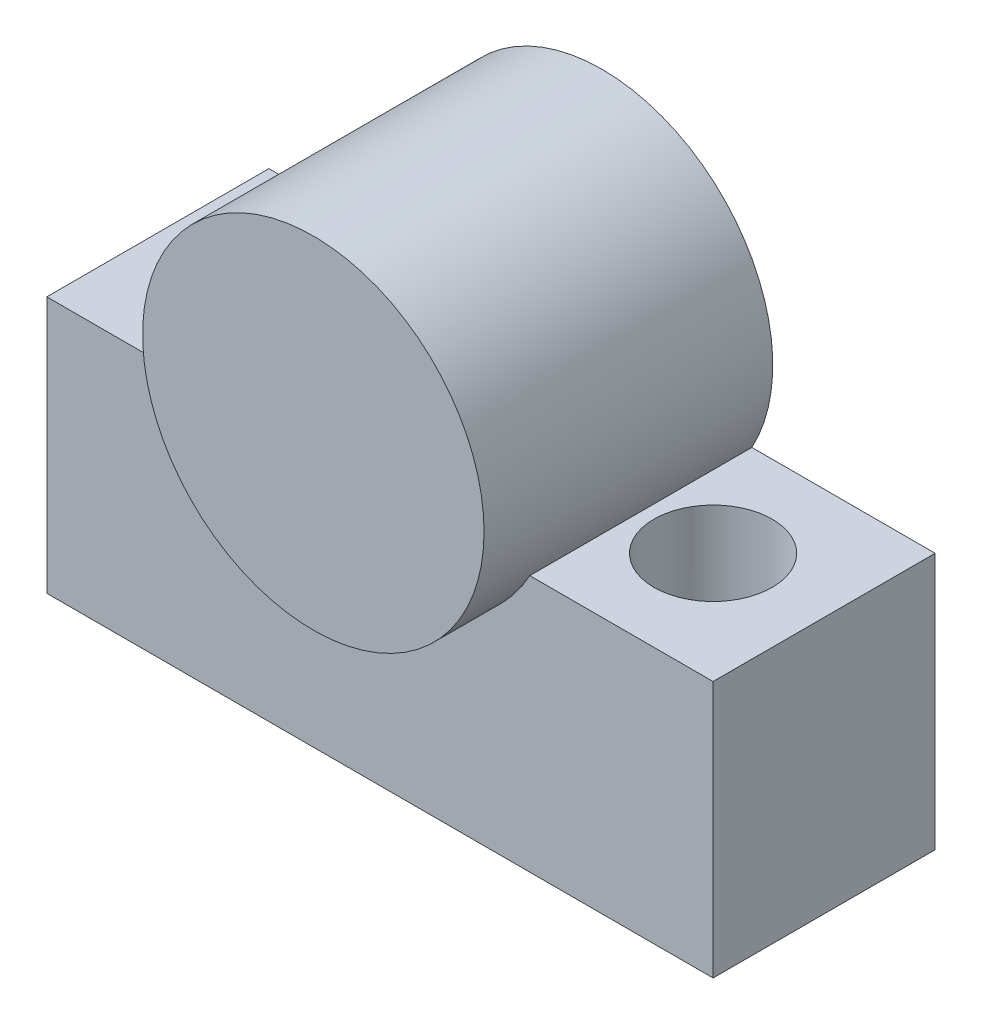
ISO-10303-21;
HEADER;
FILE_DESCRIPTION(('STEP AP214'),'2;1');
FILE_NAME('part.step','',(''),(''),'','','');
FILE_SCHEMA(('AUTOMOTIVE_DESIGN { 1 0 10303 214 1 1 1 1 }'));
ENDSEC;
DATA;
#1=APPLICATION_CONTEXT('core data for automotive mechanical design processes');
#2=APPLICATION_PROTOCOL_DEFINITION('international standard','automotive_design',2000,#1);
#3=PRODUCT_CONTEXT('',#1,'mechanical');
#4=PRODUCT('Part','Part','',(#3));
#5=PRODUCT_RELATED_PRODUCT_CATEGORY('part','',(#4));
#6=PRODUCT_DEFINITION_FORMATION('','',#4);
#7=PRODUCT_DEFINITION_CONTEXT('part definition',#1,'design');
#8=PRODUCT_DEFINITION('design','',#6,#7);
#9=PRODUCT_DEFINITION_SHAPE('','',#8);
#10=(LENGTH_UNIT() NAMED_UNIT(*) SI_UNIT(.MILLI.,.METRE.));
#11=(NAMED_UNIT(*) PLANE_ANGLE_UNIT() SI_UNIT($,.RADIAN.));
#12=(NAMED_UNIT(*) SI_UNIT($,.STERADIAN.) SOLID_ANGLE_UNIT());
#13=UNCERTAINTY_MEASURE_WITH_UNIT(LENGTH_MEASURE(1.E-05),#10,'distance_accuracy_value','');
#14=(GEOMETRIC_REPRESENTATION_CONTEXT(3) GLOBAL_UNCERTAINTY_ASSIGNED_CONTEXT((#13)) GLOBAL_UNIT_ASSIGNED_CONTEXT((#10,
#11,#12)) REPRESENTATION_CONTEXT('',''));
#15=CARTESIAN_POINT('',(0.,0.,0.));
#16=DIRECTION('',(0.,0.,1.));
#17=DIRECTION('',(1.,0.,0.));
#18=AXIS2_PLACEMENT_3D('',#15,#16,#17);
#19=CARTESIAN_POINT('',(0.,0.,5.08));
#20=DIRECTION('',(0.,0.,1.));
#21=DIRECTION('',(1.,0.,0.));
#22=AXIS2_PLACEMENT_3D('',#19,#20,#21);
#23=PLANE('',#22);
#24=CARTESIAN_POINT('',(0.,0.,5.08));
#25=DIRECTION('',(0.,0.,1.));
#26=DIRECTION('',(1.,0.,0.));
#27=AXIS2_PLACEMENT_3D('',#24,#25,#26);
#28=CIRCLE('',#27,3.90525);
#29=CARTESIAN_POINT('',(-3.42664734106094,-1.87325,5.08));
#30=VERTEX_POINT('',#29);
#31=CARTESIAN_POINT('',(3.42664734106094,-1.87325,5.08));
#32=VERTEX_POINT('',#31);
#33=EDGE_CURVE('E11',#30,#32,#28,.T.);
#34=ORIENTED_EDGE('',*,*,#33,.F.);
#35=DIRECTION('',(-1.,0.,0.));
#36=VECTOR('',#35,1.);
#37=CARTESIAN_POINT('',(-7.62,-1.87325,5.08));
#38=LINE('',#37,#36);
#39=CARTESIAN_POINT('',(-7.62,-1.87325,5.08));
#40=VERTEX_POINT('',#39);
#41=EDGE_CURVE('E53',#30,#40,#38,.T.);
#42=ORIENTED_EDGE('',*,*,#41,.T.);
#43=DIRECTION('',(0.,-1.,0.));
#44=VECTOR('',#43,1.);
#45=CARTESIAN_POINT('',(-7.62,-3.90525,5.08));
#46=LINE('',#45,#44);
#47=CARTESIAN_POINT('',(-7.62,-7.747,5.08));
#48=VERTEX_POINT('',#47);
#49=EDGE_CURVE('E150',#40,#48,#46,.T.);
#50=ORIENTED_EDGE('',*,*,#49,.T.);
#51=DIRECTION('',(-1.,0.,0.));
#52=VECTOR('',#51,1.);
#53=CARTESIAN_POINT('',(-7.62,-7.747,5.08));
#54=LINE('',#53,#52);
#55=CARTESIAN_POINT('',(7.62,-7.747,5.08));
#56=VERTEX_POINT('',#55);
#57=EDGE_CURVE('E121',#56,#48,#54,.T.);
#58=ORIENTED_EDGE('',*,*,#57,.F.);
#59=DIRECTION('',(0.,1.,0.));
#60=VECTOR('',#59,1.);
#61=CARTESIAN_POINT('',(7.62,-3.90525,5.08));
#62=LINE('',#61,#60);
#63=CARTESIAN_POINT('',(7.62,-1.87325,5.08));
#64=VERTEX_POINT('',#63);
#65=EDGE_CURVE('E82',#56,#64,#62,.T.);
#66=ORIENTED_EDGE('',*,*,#65,.T.);
#67=DIRECTION('',(-1.,0.,0.));
#68=VECTOR('',#67,1.);
#69=CARTESIAN_POINT('',(7.62,-1.87325,5.08));
#70=LINE('',#69,#68);
#71=EDGE_CURVE('E147',#64,#32,#70,.T.);
#72=ORIENTED_EDGE('',*,*,#71,.T.);
#73=EDGE_LOOP('',(#34,#42,#50,#58,#66,#72));
#74=FACE_BOUND('',#73,.T.);
#75=ADVANCED_FACE('F35',(#74),#23,.T.);
#76=CARTESIAN_POINT('',(0.,0.,0.));
#77=DIRECTION('',(0.,0.,1.));
#78=DIRECTION('',(1.,0.,0.));
#79=AXIS2_PLACEMENT_3D('',#76,#77,#78);
#80=PLANE('',#79);
#81=DIRECTION('',(0.,1.,0.));
#82=VECTOR('',#81,1.);
#83=CARTESIAN_POINT('',(7.62,-3.90525,0.));
#84=LINE('',#83,#82);
#85=CARTESIAN_POINT('',(7.62,-7.747,0.));
#86=VERTEX_POINT('',#85);
#87=CARTESIAN_POINT('',(7.62,-1.87325,0.));
#88=VERTEX_POINT('',#87);
#89=EDGE_CURVE('E112',#86,#88,#84,.T.);
#90=ORIENTED_EDGE('',*,*,#89,.F.);
#91=DIRECTION('',(1.,0.,0.));
#92=VECTOR('',#91,1.);
#93=CARTESIAN_POINT('',(-7.62,-7.747,0.));
#94=LINE('',#93,#92);
#95=CARTESIAN_POINT('',(-7.62,-7.747,0.));
#96=VERTEX_POINT('',#95);
#97=EDGE_CURVE('E108',#96,#86,#94,.T.);
#98=ORIENTED_EDGE('',*,*,#97,.F.);
#99=DIRECTION('',(0.,-1.,0.));
#100=VECTOR('',#99,1.);
#101=CARTESIAN_POINT('',(-7.62,-3.90525,0.));
#102=LINE('',#101,#100);
#103=CARTESIAN_POINT('',(-7.62,-1.87325,0.));
#104=VERTEX_POINT('',#103);
#105=EDGE_CURVE('E98',#104,#96,#102,.T.);
#106=ORIENTED_EDGE('',*,*,#105,.F.);
#107=DIRECTION('',(-1.,0.,0.));
#108=VECTOR('',#107,1.);
#109=CARTESIAN_POINT('',(-7.62,-1.87325,0.));
#110=LINE('',#109,#108);
#111=CARTESIAN_POINT('',(-3.42664734106094,-1.87325,0.));
#112=VERTEX_POINT('',#111);
#113=EDGE_CURVE('E77',#112,#104,#110,.T.);
#114=ORIENTED_EDGE('',*,*,#113,.F.);
#115=CARTESIAN_POINT('',(0.,0.,0.));
#116=DIRECTION('',(0.,0.,1.));
#117=DIRECTION('',(1.,0.,0.));
#118=AXIS2_PLACEMENT_3D('',#115,#116,#117);
#119=CIRCLE('',#118,3.90525);
#120=CARTESIAN_POINT('',(3.42664734106094,-1.87325,0.));
#121=VERTEX_POINT('',#120);
#122=EDGE_CURVE('E72',#121,#112,#119,.T.);
#123=ORIENTED_EDGE('',*,*,#122,.F.);
#124=DIRECTION('',(-1.,0.,0.));
#125=VECTOR('',#124,1.);
#126=CARTESIAN_POINT('',(7.62,-1.87325,0.));
#127=LINE('',#126,#125);
#128=EDGE_CURVE('E153',#88,#121,#127,.T.);
#129=ORIENTED_EDGE('',*,*,#128,.F.);
#130=EDGE_LOOP('',(#90,#98,#106,#114,#123,#129));
#131=FACE_BOUND('',#130,.T.);
#132=CARTESIAN_POINT('',(0.,0.,0.));
#133=DIRECTION('',(0.,0.,1.));
#134=DIRECTION('',(1.,0.,0.));
#135=AXIS2_PLACEMENT_3D('',#132,#133,#134);
#136=CIRCLE('',#135,2.38125);
#137=CARTESIAN_POINT('',(2.38125,0.,0.));
#138=VERTEX_POINT('',#137);
#139=EDGE_CURVE('E143',#138,#138,#136,.T.);
#140=ORIENTED_EDGE('',*,*,#139,.T.);
#141=EDGE_LOOP('',(#140));
#142=FACE_BOUND('',#141,.T.);
#143=ADVANCED_FACE('F109',(#131,#142),#80,.F.);
#144=CARTESIAN_POINT('',(7.62,-3.90525,5.08));
#145=DIRECTION('',(-1.,0.,0.));
#146=DIRECTION('',(0.,0.,1.));
#147=AXIS2_PLACEMENT_3D('',#144,#145,#146);
#148=PLANE('',#147);
#149=ORIENTED_EDGE('',*,*,#89,.T.);
#150=DIRECTION('',(0.,0.,-1.));
#151=VECTOR('',#150,1.);
#152=CARTESIAN_POINT('',(7.62,-1.87325,5.08));
#153=LINE('',#152,#151);
#154=EDGE_CURVE('E39',#64,#88,#153,.T.);
#155=ORIENTED_EDGE('',*,*,#154,.F.);
#156=ORIENTED_EDGE('',*,*,#65,.F.);
#157=DIRECTION('',(0.,0.,1.));
#158=VECTOR('',#157,1.);
#159=CARTESIAN_POINT('',(7.62,-7.747,0.));
#160=LINE('',#159,#158);
#161=EDGE_CURVE('E116',#86,#56,#160,.T.);
#162=ORIENTED_EDGE('',*,*,#161,.F.);
#163=EDGE_LOOP('',(#149,#155,#156,#162));
#164=FACE_BOUND('',#163,.T.);
#165=ADVANCED_FACE('F37',(#164),#148,.F.);
#166=CARTESIAN_POINT('',(7.62,-1.87325,5.08));
#167=DIRECTION('',(0.,-1.,0.));
#168=DIRECTION('',(1.,0.,0.));
#169=AXIS2_PLACEMENT_3D('',#166,#167,#168);
#170=PLANE('',#169);
#171=CARTESIAN_POINT('',(5.08,-1.87325,2.54));
#172=DIRECTION('',(0.,1.,0.));
#173=DIRECTION('',(0.,0.,1.));
#174=AXIS2_PLACEMENT_3D('',#171,#172,#173);
#175=CIRCLE('',#174,1.35255);
#176=CARTESIAN_POINT('',(5.08,-1.87325,3.89255));
#177=VERTEX_POINT('',#176);
#178=EDGE_CURVE('E134',#177,#177,#175,.T.);
#179=ORIENTED_EDGE('',*,*,#178,.F.);
#180=EDGE_LOOP('',(#179));
#181=FACE_BOUND('',#180,.T.);
#182=ORIENTED_EDGE('',*,*,#128,.T.);
#183=DIRECTION('',(0.,0.,-1.));
#184=VECTOR('',#183,1.);
#185=CARTESIAN_POINT('',(3.42664734106094,-1.87325,5.08));
#186=LINE('',#185,#184);
#187=EDGE_CURVE('E159',#32,#121,#186,.T.);
#188=ORIENTED_EDGE('',*,*,#187,.F.);
#189=ORIENTED_EDGE('',*,*,#71,.F.);
#190=ORIENTED_EDGE('',*,*,#154,.T.);
#191=EDGE_LOOP('',(#182,#188,#189,#190));
#192=FACE_BOUND('',#191,.T.);
#193=ADVANCED_FACE('F164',(#181,#192),#170,.F.);
#194=CARTESIAN_POINT('',(0.,0.,5.08));
#195=DIRECTION('',(0.,0.,-1.));
#196=DIRECTION('',(-1.,0.,0.));
#197=AXIS2_PLACEMENT_3D('',#194,#195,#196);
#198=CYLINDRICAL_SURFACE('',#197,3.90525);
#199=ORIENTED_EDGE('',*,*,#122,.T.);
#200=DIRECTION('',(0.,0.,-1.));
#201=VECTOR('',#200,1.);
#202=CARTESIAN_POINT('',(-3.42664734106094,-1.87325,5.08));
#203=LINE('',#202,#201);
#204=EDGE_CURVE('E158',#30,#112,#203,.T.);
#205=ORIENTED_EDGE('',*,*,#204,.F.);
#206=ORIENTED_EDGE('',*,*,#33,.T.);
#207=ORIENTED_EDGE('',*,*,#187,.T.);
#208=EDGE_LOOP('',(#199,#205,#206,#207));
#209=FACE_BOUND('',#208,.T.);
#210=CARTESIAN_POINT('',(0.,0.,6.604));
#211=DIRECTION('',(0.,0.,1.));
#212=DIRECTION('',(1.,0.,0.));
#213=AXIS2_PLACEMENT_3D('',#210,#211,#212);
#214=CIRCLE('',#213,3.90525);
#215=CARTESIAN_POINT('',(3.90525,0.,6.604));
#216=VERTEX_POINT('',#215);
#217=EDGE_CURVE('E137',#216,#216,#214,.T.);
#218=ORIENTED_EDGE('',*,*,#217,.F.);
#219=EDGE_LOOP('',(#218));
#220=FACE_BOUND('',#219,.T.);
#221=ADVANCED_FACE('F182',(#209,#220),#198,.T.);
#222=CARTESIAN_POINT('',(-7.62,-1.87325,5.08));
#223=DIRECTION('',(0.,-1.,0.));
#224=DIRECTION('',(0.,0.,-1.));
#225=AXIS2_PLACEMENT_3D('',#222,#223,#224);
#226=PLANE('',#225);
#227=CARTESIAN_POINT('',(-5.08,-1.87325,2.54));
#228=DIRECTION('',(0.,1.,0.));
#229=DIRECTION('',(0.,0.,1.));
#230=AXIS2_PLACEMENT_3D('',#227,#228,#229);
#231=CIRCLE('',#230,1.35255);
#232=CARTESIAN_POINT('',(-5.08,-1.87325,3.89255));
#233=VERTEX_POINT('',#232);
#234=EDGE_CURVE('E131',#233,#233,#231,.T.);
#235=ORIENTED_EDGE('',*,*,#234,.F.);
#236=EDGE_LOOP('',(#235));
#237=FACE_BOUND('',#236,.T.);
#238=ORIENTED_EDGE('',*,*,#113,.T.);
#239=DIRECTION('',(0.,0.,-1.));
#240=VECTOR('',#239,1.);
#241=CARTESIAN_POINT('',(-7.62,-1.87325,5.08));
#242=LINE('',#241,#240);
#243=EDGE_CURVE('E104',#40,#104,#242,.T.);
#244=ORIENTED_EDGE('',*,*,#243,.F.);
#245=ORIENTED_EDGE('',*,*,#41,.F.);
#246=ORIENTED_EDGE('',*,*,#204,.T.);
#247=EDGE_LOOP('',(#238,#244,#245,#246));
#248=FACE_BOUND('',#247,.T.);
#249=ADVANCED_FACE('F179',(#237,#248),#226,.F.);
#250=CARTESIAN_POINT('',(-7.62,-3.90525,5.08));
#251=DIRECTION('',(1.,0.,0.));
#252=DIRECTION('',(0.,0.,-1.));
#253=AXIS2_PLACEMENT_3D('',#250,#251,#252);
#254=PLANE('',#253);
#255=ORIENTED_EDGE('',*,*,#105,.T.);
#256=DIRECTION('',(0.,0.,-1.));
#257=VECTOR('',#256,1.);
#258=CARTESIAN_POINT('',(-7.62,-7.747,0.));
#259=LINE('',#258,#257);
#260=EDGE_CURVE('E103',#48,#96,#259,.T.);
#261=ORIENTED_EDGE('',*,*,#260,.F.);
#262=ORIENTED_EDGE('',*,*,#49,.F.);
#263=ORIENTED_EDGE('',*,*,#243,.T.);
#264=EDGE_LOOP('',(#255,#261,#262,#263));
#265=FACE_BOUND('',#264,.T.);
#266=ADVANCED_FACE('F100',(#265),#254,.F.);
#267=CARTESIAN_POINT('',(0.,0.,5.08));
#268=DIRECTION('',(0.,0.,-1.));
#269=DIRECTION('',(-1.,0.,0.));
#270=AXIS2_PLACEMENT_3D('',#267,#268,#269);
#271=CYLINDRICAL_SURFACE('',#270,2.38125);
#272=CARTESIAN_POINT('',(0.,0.,5.08));
#273=DIRECTION('',(0.,0.,1.));
#274=DIRECTION('',(1.,0.,0.));
#275=AXIS2_PLACEMENT_3D('',#272,#273,#274);
#276=CIRCLE('',#275,2.38125);
#277=CARTESIAN_POINT('',(2.38125,0.,5.08));
#278=VERTEX_POINT('',#277);
#279=EDGE_CURVE('E139',#278,#278,#276,.T.);
#280=ORIENTED_EDGE('',*,*,#279,.T.);
#281=EDGE_LOOP('',(#280));
#282=FACE_BOUND('',#281,.T.);
#283=ORIENTED_EDGE('',*,*,#139,.F.);
#284=EDGE_LOOP('',(#283));
#285=FACE_BOUND('',#284,.T.);
#286=ADVANCED_FACE('F174',(#282,#285),#271,.F.);
#287=CARTESIAN_POINT('',(0.,0.,6.604));
#288=DIRECTION('',(0.,0.,1.));
#289=DIRECTION('',(1.,0.,0.));
#290=AXIS2_PLACEMENT_3D('',#287,#288,#289);
#291=PLANE('',#290);
#292=ORIENTED_EDGE('',*,*,#217,.T.);
#293=EDGE_LOOP('',(#292));
#294=FACE_BOUND('',#293,.T.);
#295=ADVANCED_FACE('F210',(#294),#291,.T.);
#296=CARTESIAN_POINT('',(0.,0.,5.08));
#297=DIRECTION('',(0.,0.,1.));
#298=DIRECTION('',(1.,0.,0.));
#299=AXIS2_PLACEMENT_3D('',#296,#297,#298);
#300=PLANE('',#299);
#301=ORIENTED_EDGE('',*,*,#279,.F.);
#302=EDGE_LOOP('',(#301));
#303=FACE_BOUND('',#302,.T.);
#304=ADVANCED_FACE('F197',(#303),#300,.F.);
#305=CARTESIAN_POINT('',(5.08,-1.87325,2.54));
#306=DIRECTION('',(0.,1.,0.));
#307=DIRECTION('',(0.,0.,1.));
#308=AXIS2_PLACEMENT_3D('',#305,#306,#307);
#309=CYLINDRICAL_SURFACE('',#308,1.35255);
#310=ORIENTED_EDGE('',*,*,#178,.T.);
#311=EDGE_LOOP('',(#310));
#312=FACE_BOUND('',#311,.T.);
#313=CARTESIAN_POINT('',(5.08,-7.747,2.54));
#314=DIRECTION('',(0.,-1.,0.));
#315=DIRECTION('',(0.,0.,-1.));
#316=AXIS2_PLACEMENT_3D('',#313,#314,#315);
#317=CIRCLE('',#316,1.35255);
#318=CARTESIAN_POINT('',(5.08,-7.747,1.18745));
#319=VERTEX_POINT('',#318);
#320=EDGE_CURVE('E125',#319,#319,#317,.T.);
#321=ORIENTED_EDGE('',*,*,#320,.T.);
#322=EDGE_LOOP('',(#321));
#323=FACE_BOUND('',#322,.T.);
#324=ADVANCED_FACE('F193',(#312,#323),#309,.F.);
#325=CARTESIAN_POINT('',(-5.08,-1.87325,2.54));
#326=DIRECTION('',(0.,1.,0.));
#327=DIRECTION('',(0.,0.,1.));
#328=AXIS2_PLACEMENT_3D('',#325,#326,#327);
#329=CYLINDRICAL_SURFACE('',#328,1.35255);
#330=ORIENTED_EDGE('',*,*,#234,.T.);
#331=EDGE_LOOP('',(#330));
#332=FACE_BOUND('',#331,.T.);
#333=CARTESIAN_POINT('',(-5.08,-7.747,2.54));
#334=DIRECTION('',(0.,-1.,0.));
#335=DIRECTION('',(0.,0.,-1.));
#336=AXIS2_PLACEMENT_3D('',#333,#334,#335);
#337=CIRCLE('',#336,1.35255);
#338=CARTESIAN_POINT('',(-5.08,-7.747,1.18745));
#339=VERTEX_POINT('',#338);
#340=EDGE_CURVE('E122',#339,#339,#337,.T.);
#341=ORIENTED_EDGE('',*,*,#340,.T.);
#342=EDGE_LOOP('',(#341));
#343=FACE_BOUND('',#342,.T.);
#344=ADVANCED_FACE('F196',(#332,#343),#329,.F.);
#345=CARTESIAN_POINT('',(0.,-7.747,0.));
#346=DIRECTION('',(0.,1.,0.));
#347=DIRECTION('',(0.,0.,1.));
#348=AXIS2_PLACEMENT_3D('',#345,#346,#347);
#349=PLANE('',#348);
#350=ORIENTED_EDGE('',*,*,#260,.T.);
#351=ORIENTED_EDGE('',*,*,#97,.T.);
#352=ORIENTED_EDGE('',*,*,#161,.T.);
#353=ORIENTED_EDGE('',*,*,#57,.T.);
#354=EDGE_LOOP('',(#350,#351,#352,#353));
#355=FACE_BOUND('',#354,.T.);
#356=ORIENTED_EDGE('',*,*,#340,.F.);
#357=EDGE_LOOP('',(#356));
#358=FACE_BOUND('',#357,.T.);
#359=ORIENTED_EDGE('',*,*,#320,.F.);
#360=EDGE_LOOP('',(#359));
#361=FACE_BOUND('',#360,.T.);
#362=ADVANCED_FACE('F119',(#355,#358,#361),#349,.F.);
#363=CLOSED_SHELL('',(#75,#143,#165,#193,#221,#249,#266,#286,#295,#304,#324,#344,#362));
#364=MANIFOLD_SOLID_BREP('B2',#363);
#365=ADVANCED_BREP_SHAPE_REPRESENTATION('',(#18,#364),#14);
#366=SHAPE_DEFINITION_REPRESENTATION(#9,#365);
ENDSEC;
END-ISO-10303-21;
